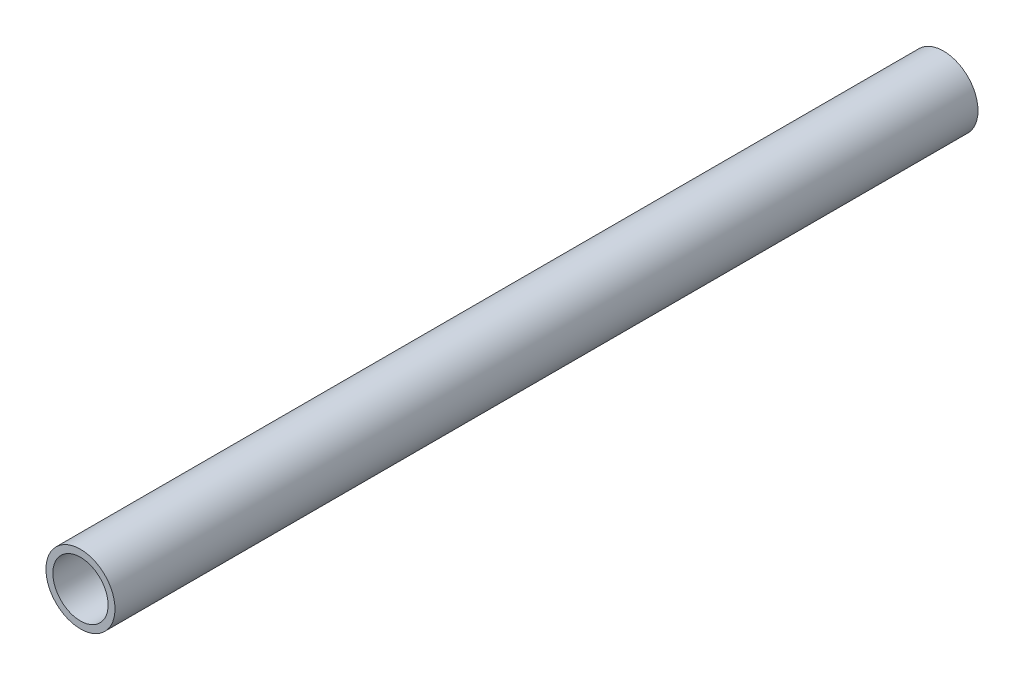
ISO-10303-21;
HEADER;
FILE_DESCRIPTION(('STEP AP214'),'2;1');
FILE_NAME('part.step','',(''),(''),'','','');
FILE_SCHEMA(('AUTOMOTIVE_DESIGN { 1 0 10303 214 1 1 1 1 }'));
ENDSEC;
DATA;
#1=APPLICATION_CONTEXT('core data for automotive mechanical design processes');
#2=APPLICATION_PROTOCOL_DEFINITION('international standard','automotive_design',2000,#1);
#3=PRODUCT_CONTEXT('',#1,'mechanical');
#4=PRODUCT('Part','Part','',(#3));
#5=PRODUCT_RELATED_PRODUCT_CATEGORY('part','',(#4));
#6=PRODUCT_DEFINITION_FORMATION('','',#4);
#7=PRODUCT_DEFINITION_CONTEXT('part definition',#1,'design');
#8=PRODUCT_DEFINITION('design','',#6,#7);
#9=PRODUCT_DEFINITION_SHAPE('','',#8);
#10=(LENGTH_UNIT() NAMED_UNIT(*) SI_UNIT(.MILLI.,.METRE.));
#11=(NAMED_UNIT(*) PLANE_ANGLE_UNIT() SI_UNIT($,.RADIAN.));
#12=(NAMED_UNIT(*) SI_UNIT($,.STERADIAN.) SOLID_ANGLE_UNIT());
#13=UNCERTAINTY_MEASURE_WITH_UNIT(LENGTH_MEASURE(1.E-05),#10,'distance_accuracy_value','');
#14=(GEOMETRIC_REPRESENTATION_CONTEXT(3) GLOBAL_UNCERTAINTY_ASSIGNED_CONTEXT((#13)) GLOBAL_UNIT_ASSIGNED_CONTEXT((#10,
#11,#12)) REPRESENTATION_CONTEXT('',''));
#15=CARTESIAN_POINT('',(0.,0.,0.));
#16=DIRECTION('',(0.,0.,1.));
#17=DIRECTION('',(1.,0.,0.));
#18=AXIS2_PLACEMENT_3D('',#15,#16,#17);
#19=CARTESIAN_POINT('',(0.,0.,250.));
#20=DIRECTION('',(0.,0.,1.));
#21=DIRECTION('',(1.,0.,0.));
#22=AXIS2_PLACEMENT_3D('',#19,#20,#21);
#23=PLANE('',#22);
#24=CARTESIAN_POINT('',(0.,0.,250.));
#25=DIRECTION('',(0.,0.,1.));
#26=DIRECTION('',(1.,0.,0.));
#27=AXIS2_PLACEMENT_3D('',#24,#25,#26);
#28=CIRCLE('',#27,10.);
#29=CARTESIAN_POINT('',(10.,0.,250.));
#30=VERTEX_POINT('',#29);
#31=EDGE_CURVE('E10',#30,#30,#28,.T.);
#32=ORIENTED_EDGE('',*,*,#31,.T.);
#33=EDGE_LOOP('',(#32));
#34=FACE_BOUND('',#33,.T.);
#35=CARTESIAN_POINT('',(0.,0.,250.));
#36=DIRECTION('',(0.,0.,1.));
#37=DIRECTION('',(1.,0.,0.));
#38=AXIS2_PLACEMENT_3D('',#35,#36,#37);
#39=CIRCLE('',#38,8.);
#40=CARTESIAN_POINT('',(8.,0.,250.));
#41=VERTEX_POINT('',#40);
#42=EDGE_CURVE('E52',#41,#41,#39,.T.);
#43=ORIENTED_EDGE('',*,*,#42,.F.);
#44=EDGE_LOOP('',(#43));
#45=FACE_BOUND('',#44,.T.);
#46=ADVANCED_FACE('F39',(#34,#45),#23,.T.);
#47=CARTESIAN_POINT('',(0.,0.,0.));
#48=DIRECTION('',(0.,0.,1.));
#49=DIRECTION('',(1.,0.,0.));
#50=AXIS2_PLACEMENT_3D('',#47,#48,#49);
#51=PLANE('',#50);
#52=CARTESIAN_POINT('',(0.,0.,0.));
#53=DIRECTION('',(0.,0.,1.));
#54=DIRECTION('',(1.,0.,0.));
#55=AXIS2_PLACEMENT_3D('',#52,#53,#54);
#56=CIRCLE('',#55,10.);
#57=CARTESIAN_POINT('',(10.,0.,0.));
#58=VERTEX_POINT('',#57);
#59=EDGE_CURVE('E43',#58,#58,#56,.T.);
#60=ORIENTED_EDGE('',*,*,#59,.F.);
#61=EDGE_LOOP('',(#60));
#62=FACE_BOUND('',#61,.T.);
#63=CARTESIAN_POINT('',(0.,0.,0.));
#64=DIRECTION('',(0.,0.,1.));
#65=DIRECTION('',(1.,0.,0.));
#66=AXIS2_PLACEMENT_3D('',#63,#64,#65);
#67=CIRCLE('',#66,8.);
#68=CARTESIAN_POINT('',(8.,0.,0.));
#69=VERTEX_POINT('',#68);
#70=EDGE_CURVE('E54',#69,#69,#67,.T.);
#71=ORIENTED_EDGE('',*,*,#70,.T.);
#72=EDGE_LOOP('',(#71));
#73=FACE_BOUND('',#72,.T.);
#74=ADVANCED_FACE('F66',(#62,#73),#51,.F.);
#75=CARTESIAN_POINT('',(0.,0.,250.));
#76=DIRECTION('',(0.,0.,-1.));
#77=DIRECTION('',(-1.,0.,0.));
#78=AXIS2_PLACEMENT_3D('',#75,#76,#77);
#79=CYLINDRICAL_SURFACE('',#78,10.);
#80=ORIENTED_EDGE('',*,*,#31,.F.);
#81=EDGE_LOOP('',(#80));
#82=FACE_BOUND('',#81,.T.);
#83=ORIENTED_EDGE('',*,*,#59,.T.);
#84=EDGE_LOOP('',(#83));
#85=FACE_BOUND('',#84,.T.);
#86=ADVANCED_FACE('F41',(#82,#85),#79,.T.);
#87=CARTESIAN_POINT('',(0.,0.,250.));
#88=DIRECTION('',(0.,0.,-1.));
#89=DIRECTION('',(-1.,0.,0.));
#90=AXIS2_PLACEMENT_3D('',#87,#88,#89);
#91=CYLINDRICAL_SURFACE('',#90,8.);
#92=ORIENTED_EDGE('',*,*,#42,.T.);
#93=EDGE_LOOP('',(#92));
#94=FACE_BOUND('',#93,.T.);
#95=ORIENTED_EDGE('',*,*,#70,.F.);
#96=EDGE_LOOP('',(#95));
#97=FACE_BOUND('',#96,.T.);
#98=ADVANCED_FACE('F62',(#94,#97),#91,.F.);
#99=CLOSED_SHELL('',(#46,#74,#86,#98));
#100=MANIFOLD_SOLID_BREP('B2',#99);
#101=ADVANCED_BREP_SHAPE_REPRESENTATION('',(#18,#100),#14);
#102=SHAPE_DEFINITION_REPRESENTATION(#9,#101);
ENDSEC;
END-ISO-10303-21;
